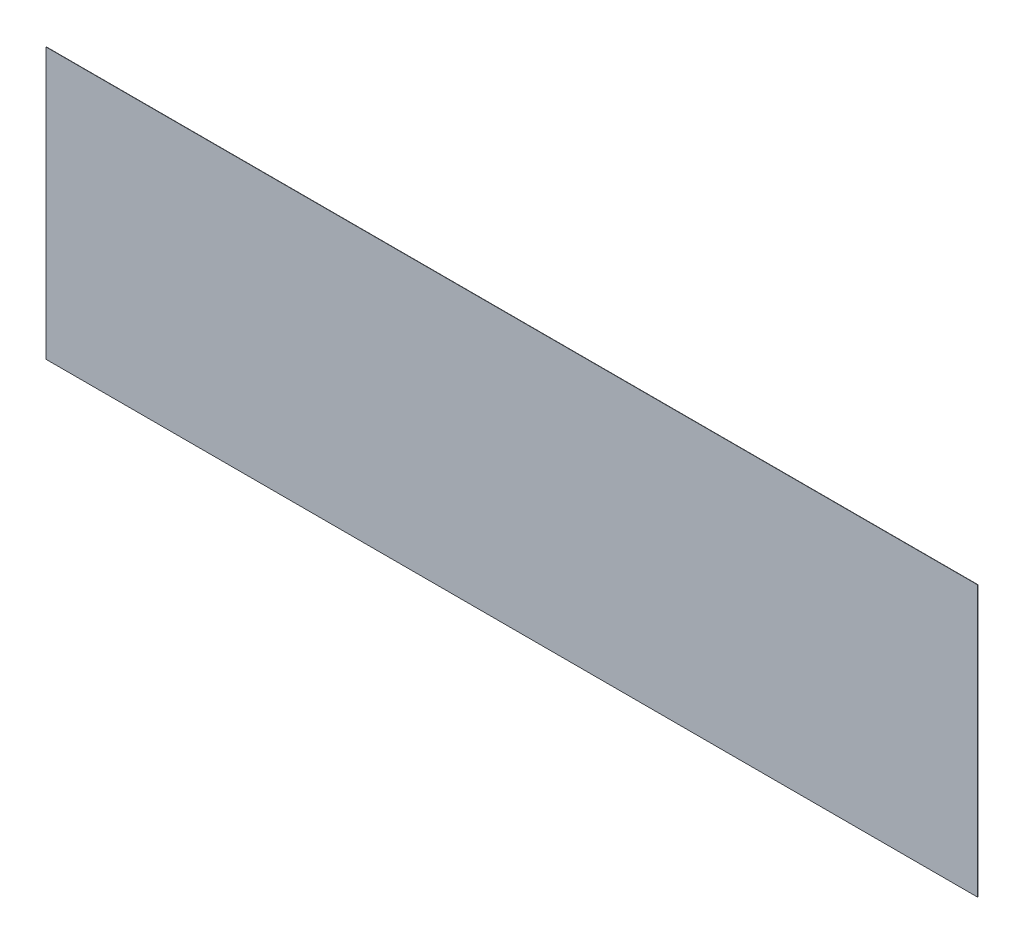
ISO-10303-21;
HEADER;
FILE_DESCRIPTION(('STEP AP214'),'2;1');
FILE_NAME('part.step','',(''),(''),'','','');
FILE_SCHEMA(('AUTOMOTIVE_DESIGN { 1 0 10303 214 1 1 1 1 }'));
ENDSEC;
DATA;
#1=APPLICATION_CONTEXT('core data for automotive mechanical design processes');
#2=APPLICATION_PROTOCOL_DEFINITION('international standard','automotive_design',2000,#1);
#3=PRODUCT_CONTEXT('',#1,'mechanical');
#4=PRODUCT('Part','Part','',(#3));
#5=PRODUCT_RELATED_PRODUCT_CATEGORY('part','',(#4));
#6=PRODUCT_DEFINITION_FORMATION('','',#4);
#7=PRODUCT_DEFINITION_CONTEXT('part definition',#1,'design');
#8=PRODUCT_DEFINITION('design','',#6,#7);
#9=PRODUCT_DEFINITION_SHAPE('','',#8);
#10=(LENGTH_UNIT() NAMED_UNIT(*) SI_UNIT(.MILLI.,.METRE.));
#11=(NAMED_UNIT(*) PLANE_ANGLE_UNIT() SI_UNIT($,.RADIAN.));
#12=(NAMED_UNIT(*) SI_UNIT($,.STERADIAN.) SOLID_ANGLE_UNIT());
#13=UNCERTAINTY_MEASURE_WITH_UNIT(LENGTH_MEASURE(1.E-05),#10,'distance_accuracy_value','');
#14=(GEOMETRIC_REPRESENTATION_CONTEXT(3) GLOBAL_UNCERTAINTY_ASSIGNED_CONTEXT((#13)) GLOBAL_UNIT_ASSIGNED_CONTEXT((#10,
#11,#12)) REPRESENTATION_CONTEXT('',''));
#15=CARTESIAN_POINT('',(0.,0.,0.));
#16=DIRECTION('',(0.,0.,1.));
#17=DIRECTION('',(1.,0.,0.));
#18=AXIS2_PLACEMENT_3D('',#15,#16,#17);
#19=CARTESIAN_POINT('',(0.,0.,0.01));
#20=DIRECTION('',(0.,0.,1.));
#21=DIRECTION('',(1.,0.,0.));
#22=AXIS2_PLACEMENT_3D('',#19,#20,#21);
#23=PLANE('',#22);
#24=DIRECTION('',(1.,0.,0.));
#25=VECTOR('',#24,1.);
#26=CARTESIAN_POINT('',(31.,9.,0.01));
#27=LINE('',#26,#25);
#28=CARTESIAN_POINT('',(0.,9.,0.01));
#29=VERTEX_POINT('',#28);
#30=CARTESIAN_POINT('',(31.,9.,0.01));
#31=VERTEX_POINT('',#30);
#32=EDGE_CURVE('E68',#29,#31,#27,.T.);
#33=ORIENTED_EDGE('',*,*,#32,.F.);
#34=DIRECTION('',(0.,1.,0.));
#35=VECTOR('',#34,1.);
#36=CARTESIAN_POINT('',(0.,9.,0.01));
#37=LINE('',#36,#35);
#38=CARTESIAN_POINT('',(0.,0.,0.01));
#39=VERTEX_POINT('',#38);
#40=EDGE_CURVE('E20',#39,#29,#37,.T.);
#41=ORIENTED_EDGE('',*,*,#40,.F.);
#42=DIRECTION('',(1.,0.,0.));
#43=VECTOR('',#42,1.);
#44=CARTESIAN_POINT('',(0.,0.,0.01));
#45=LINE('',#44,#43);
#46=CARTESIAN_POINT('',(31.,0.,0.01));
#47=VERTEX_POINT('',#46);
#48=EDGE_CURVE('E58',#47,#39,#45,.F.);
#49=ORIENTED_EDGE('',*,*,#48,.F.);
#50=DIRECTION('',(0.,1.,0.));
#51=VECTOR('',#50,1.);
#52=CARTESIAN_POINT('',(31.,0.,0.01));
#53=LINE('',#52,#51);
#54=EDGE_CURVE('E53',#31,#47,#53,.F.);
#55=ORIENTED_EDGE('',*,*,#54,.F.);
#56=EDGE_LOOP('',(#33,#41,#49,#55));
#57=FACE_BOUND('',#56,.T.);
#58=ADVANCED_FACE('F17',(#57),#23,.T.);
#59=CARTESIAN_POINT('',(0.,9.,0.));
#60=DIRECTION('',(-1.,0.,0.));
#61=DIRECTION('',(0.,0.,1.));
#62=AXIS2_PLACEMENT_3D('',#59,#60,#61);
#63=PLANE('',#62);
#64=DIRECTION('',(0.,0.,1.));
#65=VECTOR('',#64,1.);
#66=CARTESIAN_POINT('',(0.,9.,0.));
#67=LINE('',#66,#65);
#68=CARTESIAN_POINT('',(0.,9.,0.));
#69=VERTEX_POINT('',#68);
#70=EDGE_CURVE('E79',#69,#29,#67,.T.);
#71=ORIENTED_EDGE('',*,*,#70,.F.);
#72=DIRECTION('',(0.,1.,0.));
#73=VECTOR('',#72,1.);
#74=CARTESIAN_POINT('',(0.,0.,0.));
#75=LINE('',#74,#73);
#76=CARTESIAN_POINT('',(0.,0.,0.));
#77=VERTEX_POINT('',#76);
#78=EDGE_CURVE('E74',#69,#77,#75,.F.);
#79=ORIENTED_EDGE('',*,*,#78,.T.);
#80=DIRECTION('',(0.,0.,-1.));
#81=VECTOR('',#80,1.);
#82=CARTESIAN_POINT('',(0.,0.,0.));
#83=LINE('',#82,#81);
#84=EDGE_CURVE('E63',#39,#77,#83,.T.);
#85=ORIENTED_EDGE('',*,*,#84,.F.);
#86=ORIENTED_EDGE('',*,*,#40,.T.);
#87=EDGE_LOOP('',(#71,#79,#85,#86));
#88=FACE_BOUND('',#87,.T.);
#89=ADVANCED_FACE('F73',(#88),#63,.T.);
#90=CARTESIAN_POINT('',(0.,0.,0.));
#91=DIRECTION('',(0.,-1.,0.));
#92=DIRECTION('',(0.,0.,-1.));
#93=AXIS2_PLACEMENT_3D('',#90,#91,#92);
#94=PLANE('',#93);
#95=ORIENTED_EDGE('',*,*,#84,.T.);
#96=DIRECTION('',(1.,0.,0.));
#97=VECTOR('',#96,1.);
#98=CARTESIAN_POINT('',(0.,0.,0.));
#99=LINE('',#98,#97);
#100=CARTESIAN_POINT('',(31.,0.,0.));
#101=VERTEX_POINT('',#100);
#102=EDGE_CURVE('E84',#77,#101,#99,.T.);
#103=ORIENTED_EDGE('',*,*,#102,.T.);
#104=DIRECTION('',(0.,0.,-1.));
#105=VECTOR('',#104,1.);
#106=CARTESIAN_POINT('',(31.,0.,0.));
#107=LINE('',#106,#105);
#108=EDGE_CURVE('E65',#47,#101,#107,.T.);
#109=ORIENTED_EDGE('',*,*,#108,.F.);
#110=ORIENTED_EDGE('',*,*,#48,.T.);
#111=EDGE_LOOP('',(#95,#103,#109,#110));
#112=FACE_BOUND('',#111,.T.);
#113=ADVANCED_FACE('F60',(#112),#94,.T.);
#114=CARTESIAN_POINT('',(31.,0.,0.));
#115=DIRECTION('',(1.,0.,0.));
#116=DIRECTION('',(0.,0.,-1.));
#117=AXIS2_PLACEMENT_3D('',#114,#115,#116);
#118=PLANE('',#117);
#119=ORIENTED_EDGE('',*,*,#108,.T.);
#120=DIRECTION('',(0.,1.,0.));
#121=VECTOR('',#120,1.);
#122=CARTESIAN_POINT('',(31.,0.,0.));
#123=LINE('',#122,#121);
#124=CARTESIAN_POINT('',(31.,9.,0.));
#125=VERTEX_POINT('',#124);
#126=EDGE_CURVE('E26',#101,#125,#123,.T.);
#127=ORIENTED_EDGE('',*,*,#126,.T.);
#128=DIRECTION('',(0.,0.,1.));
#129=VECTOR('',#128,1.);
#130=CARTESIAN_POINT('',(31.,9.,0.));
#131=LINE('',#130,#129);
#132=EDGE_CURVE('E34',#31,#125,#131,.F.);
#133=ORIENTED_EDGE('',*,*,#132,.F.);
#134=ORIENTED_EDGE('',*,*,#54,.T.);
#135=EDGE_LOOP('',(#119,#127,#133,#134));
#136=FACE_BOUND('',#135,.T.);
#137=ADVANCED_FACE('F88',(#136),#118,.T.);
#138=CARTESIAN_POINT('',(31.,9.,0.));
#139=DIRECTION('',(0.,1.,0.));
#140=DIRECTION('',(0.,0.,1.));
#141=AXIS2_PLACEMENT_3D('',#138,#139,#140);
#142=PLANE('',#141);
#143=ORIENTED_EDGE('',*,*,#132,.T.);
#144=DIRECTION('',(1.,0.,0.));
#145=VECTOR('',#144,1.);
#146=CARTESIAN_POINT('',(0.,9.,0.));
#147=LINE('',#146,#145);
#148=EDGE_CURVE('E11',#125,#69,#147,.F.);
#149=ORIENTED_EDGE('',*,*,#148,.T.);
#150=ORIENTED_EDGE('',*,*,#70,.T.);
#151=ORIENTED_EDGE('',*,*,#32,.T.);
#152=EDGE_LOOP('',(#143,#149,#150,#151));
#153=FACE_BOUND('',#152,.T.);
#154=ADVANCED_FACE('F91',(#153),#142,.T.);
#155=CARTESIAN_POINT('',(0.,0.,0.));
#156=DIRECTION('',(0.,0.,1.));
#157=DIRECTION('',(1.,0.,0.));
#158=AXIS2_PLACEMENT_3D('',#155,#156,#157);
#159=PLANE('',#158);
#160=ORIENTED_EDGE('',*,*,#126,.F.);
#161=ORIENTED_EDGE('',*,*,#102,.F.);
#162=ORIENTED_EDGE('',*,*,#78,.F.);
#163=ORIENTED_EDGE('',*,*,#148,.F.);
#164=EDGE_LOOP('',(#160,#161,#162,#163));
#165=FACE_BOUND('',#164,.T.);
#166=ADVANCED_FACE('F90',(#165),#159,.F.);
#167=CLOSED_SHELL('',(#58,#89,#113,#137,#154,#166));
#168=MANIFOLD_SOLID_BREP('B1',#167);
#169=ADVANCED_BREP_SHAPE_REPRESENTATION('',(#18,#168),#14);
#170=SHAPE_DEFINITION_REPRESENTATION(#9,#169);
ENDSEC;
END-ISO-10303-21;
